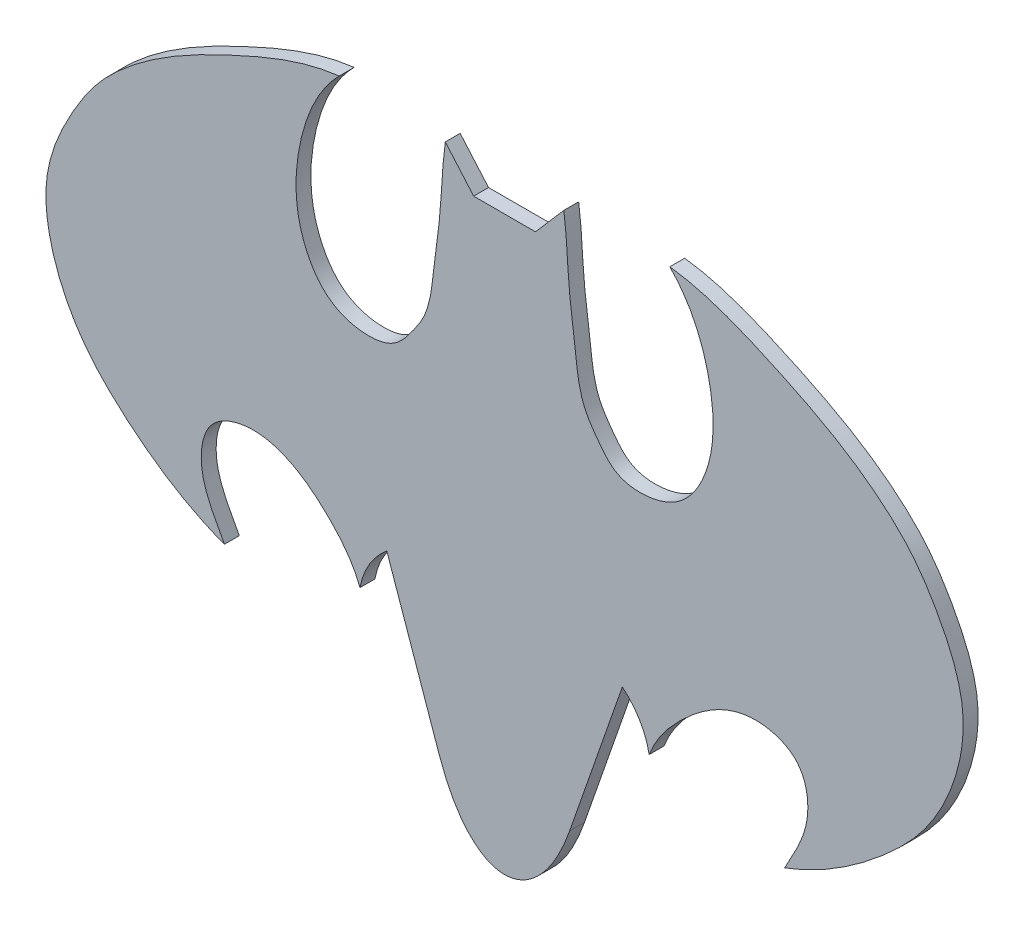
ISO-10303-21;
HEADER;
FILE_DESCRIPTION(('STEP AP214'),'2;1');
FILE_NAME('part.step','',(''),(''),'','','');
FILE_SCHEMA(('AUTOMOTIVE_DESIGN { 1 0 10303 214 1 1 1 1 }'));
ENDSEC;
DATA;
#1=APPLICATION_CONTEXT('core data for automotive mechanical design processes');
#2=APPLICATION_PROTOCOL_DEFINITION('international standard','automotive_design',2000,#1);
#3=PRODUCT_CONTEXT('',#1,'mechanical');
#4=PRODUCT('Part','Part','',(#3));
#5=PRODUCT_RELATED_PRODUCT_CATEGORY('part','',(#4));
#6=PRODUCT_DEFINITION_FORMATION('','',#4);
#7=PRODUCT_DEFINITION_CONTEXT('part definition',#1,'design');
#8=PRODUCT_DEFINITION('design','',#6,#7);
#9=PRODUCT_DEFINITION_SHAPE('','',#8);
#10=(LENGTH_UNIT() NAMED_UNIT(*) SI_UNIT(.MILLI.,.METRE.));
#11=(NAMED_UNIT(*) PLANE_ANGLE_UNIT() SI_UNIT($,.RADIAN.));
#12=(NAMED_UNIT(*) SI_UNIT($,.STERADIAN.) SOLID_ANGLE_UNIT());
#13=UNCERTAINTY_MEASURE_WITH_UNIT(LENGTH_MEASURE(1.E-05),#10,'distance_accuracy_value','');
#14=(GEOMETRIC_REPRESENTATION_CONTEXT(3) GLOBAL_UNCERTAINTY_ASSIGNED_CONTEXT((#13)) GLOBAL_UNIT_ASSIGNED_CONTEXT((#10,
#11,#12)) REPRESENTATION_CONTEXT('',''));
#15=CARTESIAN_POINT('',(0.,0.,0.));
#16=DIRECTION('',(0.,0.,1.));
#17=DIRECTION('',(1.,0.,0.));
#18=AXIS2_PLACEMENT_3D('',#15,#16,#17);
#19=CARTESIAN_POINT('',(2.91097769335724,-1.01599086634286,1.2));
#20=DIRECTION('',(-0.944146352840561,0.329526424460721,0.));
#21=DIRECTION('',(-0.329526424460721,-0.944146352840561,0.));
#22=AXIS2_PLACEMENT_3D('',#19,#20,#21);
#23=PLANE('',#22);
#24=DIRECTION('',(0.329526424460721,0.944146352840561,0.));
#25=VECTOR('',#24,1.);
#26=CARTESIAN_POINT('',(2.91097769335724,-1.01599086634286,0.));
#27=LINE('',#26,#25);
#28=CARTESIAN_POINT('',(5.24215606385606,5.66321114281078,0.));
#29=VERTEX_POINT('',#28);
#30=CARTESIAN_POINT('',(9.49550907758728,17.8497535174615,0.));
#31=VERTEX_POINT('',#30);
#32=EDGE_CURVE('E171',#29,#31,#27,.T.);
#33=ORIENTED_EDGE('',*,*,#32,.T.);
#34=DIRECTION('',(0.,0.,-1.));
#35=VECTOR('',#34,1.);
#36=CARTESIAN_POINT('',(9.49550907758728,17.8497535174615,1.2));
#37=LINE('',#36,#35);
#38=CARTESIAN_POINT('',(9.49550907758728,17.8497535174615,1.2));
#39=VERTEX_POINT('',#38);
#40=EDGE_CURVE('E11',#39,#31,#37,.T.);
#41=ORIENTED_EDGE('',*,*,#40,.F.);
#42=DIRECTION('',(0.329526424460721,0.944146352840561,0.));
#43=VECTOR('',#42,1.);
#44=CARTESIAN_POINT('',(2.91097769335724,-1.01599086634286,1.2));
#45=LINE('',#44,#43);
#46=CARTESIAN_POINT('',(5.24215606385606,5.66321114281078,1.2));
#47=VERTEX_POINT('',#46);
#48=EDGE_CURVE('E107',#47,#39,#45,.T.);
#49=ORIENTED_EDGE('',*,*,#48,.F.);
#50=DIRECTION('',(0.,0.,-1.));
#51=VECTOR('',#50,1.);
#52=CARTESIAN_POINT('',(5.24215606385606,5.66321114281078,1.2));
#53=LINE('',#52,#51);
#54=EDGE_CURVE('E163',#47,#29,#53,.T.);
#55=ORIENTED_EDGE('',*,*,#54,.T.);
#56=EDGE_LOOP('',(#33,#41,#49,#55));
#57=FACE_BOUND('',#56,.T.);
#58=ADVANCED_FACE('F37',(#57),#23,.F.);
#59=CARTESIAN_POINT('',(11.6563700098422,14.2071593745175,1.2));
#60=CARTESIAN_POINT('',(11.397676730035,15.6322639770814,1.2));
#61=CARTESIAN_POINT('',(10.2418423448879,17.5492970826512,1.2));
#62=CARTESIAN_POINT('',(7.6135805092028,19.1210919913713,1.2));
#63=CARTESIAN_POINT('',(5.45725521791302,18.2762294624857,1.2));
#64=CARTESIAN_POINT('',(3.43689695889508,16.7787112485097,1.2));
#65=CARTESIAN_POINT('',(1.33628195513624,13.9455259874936,1.2));
#66=CARTESIAN_POINT('',(0.549829783100489,11.4106469677118,1.2));
#67=CARTESIAN_POINT('',(0.,10.0000000000002,1.2));
#68=B_SPLINE_CURVE_WITH_KNOTS('',3,(#59,#60,#61,#62,#63,#64,#65,#66,#67),.UNSPECIFIED.,.F.,.F.,
(4,1,1,1,1,1,4),(0.,0.2296006125043,0.350520407054205,0.447204325314814,0.5770238243554,
0.756537919799354,1.),.UNSPECIFIED.);
#69=DIRECTION('',(0.,0.,-1.));
#70=VECTOR('',#69,1.);
#71=SURFACE_OF_LINEAR_EXTRUSION('',#68,#70);
#72=CARTESIAN_POINT('',(11.6563700098422,14.2071593745175,0.));
#73=CARTESIAN_POINT('',(11.397676730035,15.6322639770814,0.));
#74=CARTESIAN_POINT('',(10.2418423448879,17.5492970826512,0.));
#75=CARTESIAN_POINT('',(7.6135805092028,19.1210919913713,0.));
#76=CARTESIAN_POINT('',(5.45725521791302,18.2762294624857,0.));
#77=CARTESIAN_POINT('',(3.43689695889508,16.7787112485097,0.));
#78=CARTESIAN_POINT('',(1.33628195513624,13.9455259874936,0.));
#79=CARTESIAN_POINT('',(0.549829783100489,11.4106469677118,0.));
#80=CARTESIAN_POINT('',(0.,10.0000000000002,0.));
#81=B_SPLINE_CURVE_WITH_KNOTS('',3,(#72,#73,#74,#75,#76,#77,#78,#79,#80),.UNSPECIFIED.,.F.,.F.,
(4,1,1,1,1,1,4),(0.,0.2296006125043,0.350520407054205,0.447204325314814,0.5770238243554,
0.756537919799354,1.),.UNSPECIFIED.);
#82=CARTESIAN_POINT('',(11.6563700098422,14.2071593745175,0.));
#83=VERTEX_POINT('',#82);
#84=EDGE_CURVE('E308',#83,#31,#81,.T.);
#85=ORIENTED_EDGE('',*,*,#84,.F.);
#86=DIRECTION('',(0.,0.,-1.));
#87=VECTOR('',#86,1.);
#88=CARTESIAN_POINT('',(11.6563700098422,14.2071593745175,1.2));
#89=LINE('',#88,#87);
#90=CARTESIAN_POINT('',(11.6563700098422,14.2071593745175,1.2));
#91=VERTEX_POINT('',#90);
#92=EDGE_CURVE('E45',#91,#83,#89,.T.);
#93=ORIENTED_EDGE('',*,*,#92,.F.);
#94=EDGE_CURVE('E380',#91,#39,#68,.T.);
#95=ORIENTED_EDGE('',*,*,#94,.T.);
#96=ORIENTED_EDGE('',*,*,#40,.T.);
#97=EDGE_LOOP('',(#85,#93,#95,#96));
#98=FACE_BOUND('',#97,.T.);
#99=ADVANCED_FACE('F309',(#98),#71,.T.);
#100=CARTESIAN_POINT('',(22.5841524386746,11.7684734652583,1.2));
#101=CARTESIAN_POINT('',(23.3363204891086,13.1723458745344,1.2));
#102=CARTESIAN_POINT('',(24.8223688309777,15.5412172503235,1.2));
#103=CARTESIAN_POINT('',(24.152224300758,20.1442162870874,1.2));
#104=CARTESIAN_POINT('',(20.0918427920317,21.3197335137072,1.2));
#105=CARTESIAN_POINT('',(16.8154257802603,20.1167681021577,1.2));
#106=CARTESIAN_POINT('',(13.8873672886592,17.7527385178038,1.2));
#107=CARTESIAN_POINT('',(12.2178512937736,15.7059440536443,1.2));
#108=CARTESIAN_POINT('',(11.6563700098422,14.2071593745175,1.2));
#109=B_SPLINE_CURVE_WITH_KNOTS('',3,(#100,#101,#102,#103,#104,#105,#106,#107,#108),
.UNSPECIFIED.,.F.,.F.,(4,1,1,1,1,1,4),(0.,0.205854259329102,0.355134320336196,0.518085323207197,
0.666937553174599,0.795303167325571,1.),.UNSPECIFIED.);
#110=DIRECTION('',(0.,0.,-1.));
#111=VECTOR('',#110,1.);
#112=SURFACE_OF_LINEAR_EXTRUSION('',#109,#111);
#113=CARTESIAN_POINT('',(22.5841524386746,11.7684734652583,0.));
#114=CARTESIAN_POINT('',(23.3363204891086,13.1723458745344,0.));
#115=CARTESIAN_POINT('',(24.8223688309777,15.5412172503235,0.));
#116=CARTESIAN_POINT('',(24.152224300758,20.1442162870874,0.));
#117=CARTESIAN_POINT('',(20.0918427920317,21.3197335137072,0.));
#118=CARTESIAN_POINT('',(16.8154257802603,20.1167681021577,0.));
#119=CARTESIAN_POINT('',(13.8873672886592,17.7527385178038,0.));
#120=CARTESIAN_POINT('',(12.2178512937736,15.7059440536443,0.));
#121=CARTESIAN_POINT('',(11.6563700098422,14.2071593745175,0.));
#122=B_SPLINE_CURVE_WITH_KNOTS('',3,(#113,#114,#115,#116,#117,#118,#119,#120,#121),
.UNSPECIFIED.,.F.,.F.,(4,1,1,1,1,1,4),(0.,0.205854259329102,0.355134320336196,0.518085323207197,
0.666937553174599,0.795303167325571,1.),.UNSPECIFIED.);
#123=CARTESIAN_POINT('',(22.5841524386746,11.7684734652583,0.));
#124=VERTEX_POINT('',#123);
#125=EDGE_CURVE('E301',#124,#83,#122,.T.);
#126=ORIENTED_EDGE('',*,*,#125,.F.);
#127=DIRECTION('',(0.,0.,-1.));
#128=VECTOR('',#127,1.);
#129=CARTESIAN_POINT('',(22.5841524386746,11.7684734652583,1.2));
#130=LINE('',#129,#128);
#131=CARTESIAN_POINT('',(22.5841524386746,11.7684734652583,1.2));
#132=VERTEX_POINT('',#131);
#133=EDGE_CURVE('E294',#132,#124,#130,.T.);
#134=ORIENTED_EDGE('',*,*,#133,.F.);
#135=EDGE_CURVE('E304',#132,#91,#109,.T.);
#136=ORIENTED_EDGE('',*,*,#135,.T.);
#137=ORIENTED_EDGE('',*,*,#92,.T.);
#138=EDGE_LOOP('',(#126,#134,#136,#137));
#139=FACE_BOUND('',#138,.T.);
#140=ADVANCED_FACE('F299',(#139),#112,.T.);
#141=CARTESIAN_POINT('',(13.3216493928343,49.0966009830844,1.2));
#142=CARTESIAN_POINT('',(15.4924640287297,48.8365696630427,1.2));
#143=CARTESIAN_POINT('',(18.4698741281813,47.8177588608282,1.2));
#144=CARTESIAN_POINT('',(22.3145465703154,46.0821036797363,1.2));
#145=CARTESIAN_POINT('',(26.0368496464502,44.2686057979136,1.2));
#146=CARTESIAN_POINT('',(29.7302468118731,41.9345347446466,1.2));
#147=CARTESIAN_POINT('',(32.9847805520693,38.8231998492142,1.2));
#148=CARTESIAN_POINT('',(35.372450417055,35.1051659014336,1.2));
#149=CARTESIAN_POINT('',(37.2566291173604,30.7817907532244,1.2));
#150=CARTESIAN_POINT('',(36.8240330322669,26.309450685527,1.2));
#151=CARTESIAN_POINT('',(35.6172776180551,22.7641563490727,1.2));
#152=CARTESIAN_POINT('',(33.6605380217441,19.5702819058924,1.2));
#153=CARTESIAN_POINT('',(29.4402091246139,15.4306585171175,1.2));
#154=CARTESIAN_POINT('',(25.6634078981303,12.9155387615074,1.2));
#155=CARTESIAN_POINT('',(22.5841524386746,11.7684734652583,1.2));
#156=B_SPLINE_CURVE_WITH_KNOTS('',3,(#141,#142,#143,#144,#145,#146,#147,#148,#149,#150,#151,
#152,#153,#154,#155),.UNSPECIFIED.,.F.,.F.,(4,1,1,1,1,1,1,1,1,1,1,1,4),(0.,0.114464816633258,
0.165055863543866,0.222504687994984,0.332841562793707,0.394026530237335,0.45800770000997,
0.565829823981422,0.633836882505996,0.689565343984703,0.762737099766238,0.828769581828576,1.),.UNSPECIFIED.);
#157=DIRECTION('',(0.,0.,-1.));
#158=VECTOR('',#157,1.);
#159=SURFACE_OF_LINEAR_EXTRUSION('',#156,#158);
#160=CARTESIAN_POINT('',(13.3216493928343,49.0966009830844,0.));
#161=CARTESIAN_POINT('',(15.4924640287297,48.8365696630427,0.));
#162=CARTESIAN_POINT('',(18.4698741281813,47.8177588608282,0.));
#163=CARTESIAN_POINT('',(22.3145465703154,46.0821036797363,0.));
#164=CARTESIAN_POINT('',(26.0368496464502,44.2686057979136,0.));
#165=CARTESIAN_POINT('',(29.7302468118731,41.9345347446466,0.));
#166=CARTESIAN_POINT('',(32.9847805520693,38.8231998492142,0.));
#167=CARTESIAN_POINT('',(35.372450417055,35.1051659014336,0.));
#168=CARTESIAN_POINT('',(37.2566291173604,30.7817907532244,0.));
#169=CARTESIAN_POINT('',(36.8240330322669,26.309450685527,0.));
#170=CARTESIAN_POINT('',(35.6172776180551,22.7641563490727,0.));
#171=CARTESIAN_POINT('',(33.6605380217441,19.5702819058924,0.));
#172=CARTESIAN_POINT('',(29.4402091246139,15.4306585171175,0.));
#173=CARTESIAN_POINT('',(25.6634078981303,12.9155387615074,0.));
#174=CARTESIAN_POINT('',(22.5841524386746,11.7684734652583,0.));
#175=B_SPLINE_CURVE_WITH_KNOTS('',3,(#160,#161,#162,#163,#164,#165,#166,#167,#168,#169,#170,
#171,#172,#173,#174),.UNSPECIFIED.,.F.,.F.,(4,1,1,1,1,1,1,1,1,1,1,1,4),(0.,0.114464816633258,
0.165055863543866,0.222504687994984,0.332841562793707,0.394026530237335,0.45800770000997,
0.565829823981422,0.633836882505996,0.689565343984703,0.762737099766238,0.828769581828576,1.),.UNSPECIFIED.);
#176=CARTESIAN_POINT('',(13.3216493928343,49.0966009830844,0.));
#177=VERTEX_POINT('',#176);
#178=EDGE_CURVE('E315',#177,#124,#175,.T.);
#179=ORIENTED_EDGE('',*,*,#178,.F.);
#180=DIRECTION('',(0.,0.,-1.));
#181=VECTOR('',#180,1.);
#182=CARTESIAN_POINT('',(13.3216493928343,49.0966009830844,1.2));
#183=LINE('',#182,#181);
#184=CARTESIAN_POINT('',(13.3216493928343,49.0966009830844,1.2));
#185=VERTEX_POINT('',#184);
#186=EDGE_CURVE('E292',#185,#177,#183,.T.);
#187=ORIENTED_EDGE('',*,*,#186,.F.);
#188=EDGE_CURVE('E246',#185,#132,#156,.T.);
#189=ORIENTED_EDGE('',*,*,#188,.T.);
#190=ORIENTED_EDGE('',*,*,#133,.T.);
#191=EDGE_LOOP('',(#179,#187,#189,#190));
#192=FACE_BOUND('',#191,.T.);
#193=ADVANCED_FACE('F235',(#192),#159,.T.);
#194=CARTESIAN_POINT('',(4.77721824076915,48.7658811138146,1.2));
#195=CARTESIAN_POINT('',(5.03050292995623,47.0281789536312,1.2));
#196=CARTESIAN_POINT('',(5.07303657499563,43.8534602594582,1.2));
#197=CARTESIAN_POINT('',(5.73146001713426,39.5651755041231,1.2));
#198=CARTESIAN_POINT('',(6.03370024447577,36.2260769045719,1.2));
#199=CARTESIAN_POINT('',(7.51298516193875,34.0787207748022,1.2));
#200=CARTESIAN_POINT('',(8.83753959519586,32.3656009643095,1.2));
#201=CARTESIAN_POINT('',(11.4705553930665,31.9512170833034,1.2));
#202=CARTESIAN_POINT('',(14.2334724200595,32.7938033800342,1.2));
#203=CARTESIAN_POINT('',(16.1609704196722,35.5183898233696,1.2));
#204=CARTESIAN_POINT('',(16.9877876127939,38.9067980806341,1.2));
#205=CARTESIAN_POINT('',(16.5543103145127,43.8287993359296,1.2));
#206=CARTESIAN_POINT('',(15.0510316387489,47.3674564948699,1.2));
#207=CARTESIAN_POINT('',(13.3216493928343,49.0966009830844,1.2));
#208=B_SPLINE_CURVE_WITH_KNOTS('',3,(#194,#195,#196,#197,#198,#199,#200,#201,#202,#203,#204,
#205,#206,#207),.UNSPECIFIED.,.F.,.F.,(4,1,1,1,1,1,1,1,1,1,1,4),(0.,0.131609133993092,
0.235936851986378,0.328168246784935,0.373910171744129,0.430745972127253,0.482425313130639,
0.562606571701551,0.634043740261748,0.721471282750536,0.819469906842683,1.),.UNSPECIFIED.);
#209=DIRECTION('',(0.,0.,-1.));
#210=VECTOR('',#209,1.);
#211=SURFACE_OF_LINEAR_EXTRUSION('',#208,#210);
#212=CARTESIAN_POINT('',(4.77721824076915,48.7658811138146,0.));
#213=CARTESIAN_POINT('',(5.03050292995623,47.0281789536312,0.));
#214=CARTESIAN_POINT('',(5.07303657499563,43.8534602594582,0.));
#215=CARTESIAN_POINT('',(5.73146001713426,39.5651755041231,0.));
#216=CARTESIAN_POINT('',(6.03370024447577,36.2260769045719,0.));
#217=CARTESIAN_POINT('',(7.51298516193875,34.0787207748022,0.));
#218=CARTESIAN_POINT('',(8.83753959519586,32.3656009643095,0.));
#219=CARTESIAN_POINT('',(11.4705553930665,31.9512170833034,0.));
#220=CARTESIAN_POINT('',(14.2334724200595,32.7938033800342,0.));
#221=CARTESIAN_POINT('',(16.1609704196722,35.5183898233696,0.));
#222=CARTESIAN_POINT('',(16.9877876127939,38.9067980806341,0.));
#223=CARTESIAN_POINT('',(16.5543103145127,43.8287993359296,0.));
#224=CARTESIAN_POINT('',(15.0510316387489,47.3674564948699,0.));
#225=CARTESIAN_POINT('',(13.3216493928343,49.0966009830844,0.));
#226=B_SPLINE_CURVE_WITH_KNOTS('',3,(#212,#213,#214,#215,#216,#217,#218,#219,#220,#221,#222,
#223,#224,#225),.UNSPECIFIED.,.F.,.F.,(4,1,1,1,1,1,1,1,1,1,1,4),(0.,0.131609133993092,
0.235936851986378,0.328168246784935,0.373910171744129,0.430745972127253,0.482425313130639,
0.562606571701551,0.634043740261748,0.721471282750536,0.819469906842683,1.),.UNSPECIFIED.);
#227=CARTESIAN_POINT('',(4.77721824076915,48.7658811138146,0.));
#228=VERTEX_POINT('',#227);
#229=EDGE_CURVE('E317',#228,#177,#226,.T.);
#230=ORIENTED_EDGE('',*,*,#229,.F.);
#231=DIRECTION('',(0.,0.,-1.));
#232=VECTOR('',#231,1.);
#233=CARTESIAN_POINT('',(4.77721824076915,48.7658811138146,1.2));
#234=LINE('',#233,#232);
#235=CARTESIAN_POINT('',(4.77721824076915,48.7658811138146,1.2));
#236=VERTEX_POINT('',#235);
#237=EDGE_CURVE('E290',#236,#228,#234,.T.);
#238=ORIENTED_EDGE('',*,*,#237,.F.);
#239=EDGE_CURVE('E239',#236,#185,#208,.T.);
#240=ORIENTED_EDGE('',*,*,#239,.T.);
#241=ORIENTED_EDGE('',*,*,#186,.T.);
#242=EDGE_LOOP('',(#230,#238,#240,#241));
#243=FACE_BOUND('',#242,.T.);
#244=ADVANCED_FACE('F230',(#243),#211,.T.);
#245=CARTESIAN_POINT('',(-21.3961918610227,18.5078672802146,1.2));
#246=DIRECTION('',(-0.756309780410387,0.654213662388361,0.));
#247=DIRECTION('',(-0.654213662388361,-0.756309780410387,0.));
#248=AXIS2_PLACEMENT_3D('',#245,#246,#247);
#249=PLANE('',#248);
#250=DIRECTION('',(0.654213662388362,0.756309780410387,0.));
#251=VECTOR('',#250,1.);
#252=CARTESIAN_POINT('',(-21.3961918610227,18.5078672802146,0.));
#253=LINE('',#252,#251);
#254=CARTESIAN_POINT('',(2.49171451387908,46.1237033037382,0.));
#255=VERTEX_POINT('',#254);
#256=EDGE_CURVE('E335',#255,#228,#253,.T.);
#257=ORIENTED_EDGE('',*,*,#256,.F.);
#258=DIRECTION('',(0.,0.,-1.));
#259=VECTOR('',#258,1.);
#260=CARTESIAN_POINT('',(2.49171451387908,46.1237033037382,1.2));
#261=LINE('',#260,#259);
#262=CARTESIAN_POINT('',(2.49171451387908,46.1237033037382,1.2));
#263=VERTEX_POINT('',#262);
#264=EDGE_CURVE('E288',#263,#255,#261,.T.);
#265=ORIENTED_EDGE('',*,*,#264,.F.);
#266=DIRECTION('',(0.654213662388362,0.756309780410387,0.));
#267=VECTOR('',#266,1.);
#268=CARTESIAN_POINT('',(-21.3961918610227,18.5078672802146,1.2));
#269=LINE('',#268,#267);
#270=EDGE_CURVE('E245',#263,#236,#269,.T.);
#271=ORIENTED_EDGE('',*,*,#270,.T.);
#272=ORIENTED_EDGE('',*,*,#237,.T.);
#273=EDGE_LOOP('',(#257,#265,#271,#272));
#274=FACE_BOUND('',#273,.T.);
#275=ADVANCED_FACE('F226',(#274),#249,.T.);
#276=CARTESIAN_POINT('',(0.,46.1237033037382,1.2));
#277=DIRECTION('',(0.,1.,0.));
#278=DIRECTION('',(0.,0.,1.));
#279=AXIS2_PLACEMENT_3D('',#276,#277,#278);
#280=PLANE('',#279);
#281=DIRECTION('',(1.,0.,0.));
#282=VECTOR('',#281,1.);
#283=CARTESIAN_POINT('',(0.,46.1237033037382,0.));
#284=LINE('',#283,#282);
#285=CARTESIAN_POINT('',(-2.49171451387912,46.1237033037382,0.));
#286=VERTEX_POINT('',#285);
#287=EDGE_CURVE('E341',#286,#255,#284,.T.);
#288=ORIENTED_EDGE('',*,*,#287,.F.);
#289=DIRECTION('',(0.,0.,-1.));
#290=VECTOR('',#289,1.);
#291=CARTESIAN_POINT('',(-2.49171451387912,46.1237033037382,1.2));
#292=LINE('',#291,#290);
#293=CARTESIAN_POINT('',(-2.49171451387912,46.1237033037382,1.2));
#294=VERTEX_POINT('',#293);
#295=EDGE_CURVE('E268',#294,#286,#292,.T.);
#296=ORIENTED_EDGE('',*,*,#295,.F.);
#297=DIRECTION('',(1.,0.,0.));
#298=VECTOR('',#297,1.);
#299=CARTESIAN_POINT('',(0.,46.1237033037382,1.2));
#300=LINE('',#299,#298);
#301=EDGE_CURVE('E255',#294,#263,#300,.T.);
#302=ORIENTED_EDGE('',*,*,#301,.T.);
#303=ORIENTED_EDGE('',*,*,#264,.T.);
#304=EDGE_LOOP('',(#288,#296,#302,#303));
#305=FACE_BOUND('',#304,.T.);
#306=ADVANCED_FACE('F222',(#305),#280,.T.);
#307=CARTESIAN_POINT('',(21.3961918610227,18.5078672802146,1.2));
#308=DIRECTION('',(-0.756309780410387,-0.654213662388361,0.));
#309=DIRECTION('',(0.654213662388361,-0.756309780410387,0.));
#310=AXIS2_PLACEMENT_3D('',#307,#308,#309);
#311=PLANE('',#310);
#312=DIRECTION('',(-0.654213662388362,0.756309780410387,0.));
#313=VECTOR('',#312,1.);
#314=CARTESIAN_POINT('',(21.3961918610227,18.5078672802146,0.));
#315=LINE('',#314,#313);
#316=CARTESIAN_POINT('',(-4.77721824076919,48.7658811138146,0.));
#317=VERTEX_POINT('',#316);
#318=EDGE_CURVE('E266',#286,#317,#315,.T.);
#319=ORIENTED_EDGE('',*,*,#318,.T.);
#320=DIRECTION('',(0.,0.,-1.));
#321=VECTOR('',#320,1.);
#322=CARTESIAN_POINT('',(-4.77721824076919,48.7658811138146,1.2));
#323=LINE('',#322,#321);
#324=CARTESIAN_POINT('',(-4.77721824076919,48.7658811138146,1.2));
#325=VERTEX_POINT('',#324);
#326=EDGE_CURVE('E264',#325,#317,#323,.T.);
#327=ORIENTED_EDGE('',*,*,#326,.F.);
#328=DIRECTION('',(-0.654213662388362,0.756309780410387,0.));
#329=VECTOR('',#328,1.);
#330=CARTESIAN_POINT('',(21.3961918610227,18.5078672802146,1.2));
#331=LINE('',#330,#329);
#332=EDGE_CURVE('E210',#294,#325,#331,.T.);
#333=ORIENTED_EDGE('',*,*,#332,.F.);
#334=ORIENTED_EDGE('',*,*,#295,.T.);
#335=EDGE_LOOP('',(#319,#327,#333,#334));
#336=FACE_BOUND('',#335,.T.);
#337=ADVANCED_FACE('F218',(#336),#311,.F.);
#338=CARTESIAN_POINT('',(-4.7772182407692,48.7658811138146,1.2));
#339=CARTESIAN_POINT('',(-5.03050292995629,47.0281789536312,1.2));
#340=CARTESIAN_POINT('',(-5.07303657499568,43.8534602594582,1.2));
#341=CARTESIAN_POINT('',(-5.7314600171343,39.5651755041231,1.2));
#342=CARTESIAN_POINT('',(-6.03370024447582,36.2260769045719,1.2));
#343=CARTESIAN_POINT('',(-7.5129851619388,34.0787207748022,1.2));
#344=CARTESIAN_POINT('',(-8.83753959519589,32.3656009643095,1.2));
#345=CARTESIAN_POINT('',(-11.4705553930665,31.9512170833034,1.2));
#346=CARTESIAN_POINT('',(-14.2334724200596,32.7938033800342,1.2));
#347=CARTESIAN_POINT('',(-16.1609704196723,35.5183898233696,1.2));
#348=CARTESIAN_POINT('',(-16.9877876127939,38.9067980806341,1.2));
#349=CARTESIAN_POINT('',(-16.5543103145128,43.8287993359296,1.2));
#350=CARTESIAN_POINT('',(-15.0510316387489,47.3674564948699,1.2));
#351=CARTESIAN_POINT('',(-13.3216493928344,49.0966009830844,1.2));
#352=B_SPLINE_CURVE_WITH_KNOTS('',3,(#338,#339,#340,#341,#342,#343,#344,#345,#346,#347,#348,
#349,#350,#351),.UNSPECIFIED.,.F.,.F.,(4,1,1,1,1,1,1,1,1,1,1,4),(0.,0.131609133993092,
0.235936851986378,0.328168246784935,0.373910171744128,0.430745972127253,0.482425313130639,
0.562606571701551,0.634043740261748,0.721471282750536,0.819469906842683,1.),.UNSPECIFIED.);
#353=DIRECTION('',(0.,0.,-1.));
#354=VECTOR('',#353,1.);
#355=SURFACE_OF_LINEAR_EXTRUSION('',#352,#354);
#356=CARTESIAN_POINT('',(-4.7772182407692,48.7658811138146,0.));
#357=CARTESIAN_POINT('',(-5.03050292995629,47.0281789536312,0.));
#358=CARTESIAN_POINT('',(-5.07303657499568,43.8534602594582,0.));
#359=CARTESIAN_POINT('',(-5.7314600171343,39.5651755041231,0.));
#360=CARTESIAN_POINT('',(-6.03370024447582,36.2260769045719,0.));
#361=CARTESIAN_POINT('',(-7.5129851619388,34.0787207748022,0.));
#362=CARTESIAN_POINT('',(-8.83753959519589,32.3656009643095,0.));
#363=CARTESIAN_POINT('',(-11.4705553930665,31.9512170833034,0.));
#364=CARTESIAN_POINT('',(-14.2334724200596,32.7938033800342,0.));
#365=CARTESIAN_POINT('',(-16.1609704196723,35.5183898233696,0.));
#366=CARTESIAN_POINT('',(-16.9877876127939,38.9067980806341,0.));
#367=CARTESIAN_POINT('',(-16.5543103145128,43.8287993359296,0.));
#368=CARTESIAN_POINT('',(-15.0510316387489,47.3674564948699,0.));
#369=CARTESIAN_POINT('',(-13.3216493928344,49.0966009830844,0.));
#370=B_SPLINE_CURVE_WITH_KNOTS('',3,(#356,#357,#358,#359,#360,#361,#362,#363,#364,#365,#366,
#367,#368,#369),.UNSPECIFIED.,.F.,.F.,(4,1,1,1,1,1,1,1,1,1,1,4),(0.,0.131609133993092,
0.235936851986378,0.328168246784935,0.373910171744128,0.430745972127253,0.482425313130639,
0.562606571701551,0.634043740261748,0.721471282750536,0.819469906842683,1.),.UNSPECIFIED.);
#371=CARTESIAN_POINT('',(-13.3216493928344,49.0966009830844,0.));
#372=VERTEX_POINT('',#371);
#373=EDGE_CURVE('E273',#317,#372,#370,.T.);
#374=ORIENTED_EDGE('',*,*,#373,.T.);
#375=DIRECTION('',(0.,0.,-1.));
#376=VECTOR('',#375,1.);
#377=CARTESIAN_POINT('',(-13.3216493928344,49.0966009830844,1.2));
#378=LINE('',#377,#376);
#379=CARTESIAN_POINT('',(-13.3216493928344,49.0966009830844,1.2));
#380=VERTEX_POINT('',#379);
#381=EDGE_CURVE('E269',#380,#372,#378,.T.);
#382=ORIENTED_EDGE('',*,*,#381,.F.);
#383=EDGE_CURVE('E202',#325,#380,#352,.T.);
#384=ORIENTED_EDGE('',*,*,#383,.F.);
#385=ORIENTED_EDGE('',*,*,#326,.T.);
#386=EDGE_LOOP('',(#374,#382,#384,#385));
#387=FACE_BOUND('',#386,.T.);
#388=ADVANCED_FACE('F215',(#387),#355,.F.);
#389=CARTESIAN_POINT('',(-13.3216493928344,49.0966009830844,1.2));
#390=CARTESIAN_POINT('',(-15.4924640287298,48.8365696630427,1.2));
#391=CARTESIAN_POINT('',(-18.4698741281814,47.8177588608282,1.2));
#392=CARTESIAN_POINT('',(-22.3145465703154,46.0821036797362,1.2));
#393=CARTESIAN_POINT('',(-26.0368496464502,44.2686057979136,1.2));
#394=CARTESIAN_POINT('',(-29.7302468118732,41.9345347446465,1.2));
#395=CARTESIAN_POINT('',(-32.9847805520694,38.8231998492141,1.2));
#396=CARTESIAN_POINT('',(-35.372450417055,35.1051659014335,1.2));
#397=CARTESIAN_POINT('',(-37.2566291173604,30.7817907532244,1.2));
#398=CARTESIAN_POINT('',(-36.8240330322669,26.309450685527,1.2));
#399=CARTESIAN_POINT('',(-35.6172776180551,22.7641563490727,1.2));
#400=CARTESIAN_POINT('',(-33.6605380217441,19.5702819058924,1.2));
#401=CARTESIAN_POINT('',(-29.4402091246139,15.4306585171175,1.2));
#402=CARTESIAN_POINT('',(-25.6634078981304,12.9155387615073,1.2));
#403=CARTESIAN_POINT('',(-22.5841524386747,11.7684734652583,1.2));
#404=B_SPLINE_CURVE_WITH_KNOTS('',3,(#389,#390,#391,#392,#393,#394,#395,#396,#397,#398,#399,
#400,#401,#402,#403),.UNSPECIFIED.,.F.,.F.,(4,1,1,1,1,1,1,1,1,1,1,1,4),(0.,0.114464816633258,
0.165055863543866,0.222504687994984,0.332841562793707,0.394026530237335,0.45800770000997,
0.565829823981422,0.633836882505996,0.689565343984703,0.762737099766238,0.828769581828576,1.),.UNSPECIFIED.);
#405=DIRECTION('',(0.,0.,-1.));
#406=VECTOR('',#405,1.);
#407=SURFACE_OF_LINEAR_EXTRUSION('',#404,#406);
#408=CARTESIAN_POINT('',(-13.3216493928344,49.0966009830844,0.));
#409=CARTESIAN_POINT('',(-15.4924640287298,48.8365696630427,0.));
#410=CARTESIAN_POINT('',(-18.4698741281814,47.8177588608282,0.));
#411=CARTESIAN_POINT('',(-22.3145465703154,46.0821036797362,0.));
#412=CARTESIAN_POINT('',(-26.0368496464502,44.2686057979136,0.));
#413=CARTESIAN_POINT('',(-29.7302468118732,41.9345347446465,0.));
#414=CARTESIAN_POINT('',(-32.9847805520694,38.8231998492141,0.));
#415=CARTESIAN_POINT('',(-35.372450417055,35.1051659014335,0.));
#416=CARTESIAN_POINT('',(-37.2566291173604,30.7817907532244,0.));
#417=CARTESIAN_POINT('',(-36.8240330322669,26.309450685527,0.));
#418=CARTESIAN_POINT('',(-35.6172776180551,22.7641563490727,0.));
#419=CARTESIAN_POINT('',(-33.6605380217441,19.5702819058924,0.));
#420=CARTESIAN_POINT('',(-29.4402091246139,15.4306585171175,0.));
#421=CARTESIAN_POINT('',(-25.6634078981304,12.9155387615073,0.));
#422=CARTESIAN_POINT('',(-22.5841524386747,11.7684734652583,0.));
#423=B_SPLINE_CURVE_WITH_KNOTS('',3,(#408,#409,#410,#411,#412,#413,#414,#415,#416,#417,#418,
#419,#420,#421,#422),.UNSPECIFIED.,.F.,.F.,(4,1,1,1,1,1,1,1,1,1,1,1,4),(0.,0.114464816633258,
0.165055863543866,0.222504687994984,0.332841562793707,0.394026530237335,0.45800770000997,
0.565829823981422,0.633836882505996,0.689565343984703,0.762737099766238,0.828769581828576,1.),.UNSPECIFIED.);
#424=CARTESIAN_POINT('',(-22.5841524386747,11.7684734652583,0.));
#425=VERTEX_POINT('',#424);
#426=EDGE_CURVE('E280',#372,#425,#423,.T.);
#427=ORIENTED_EDGE('',*,*,#426,.T.);
#428=DIRECTION('',(0.,0.,-1.));
#429=VECTOR('',#428,1.);
#430=CARTESIAN_POINT('',(-22.5841524386747,11.7684734652583,1.2));
#431=LINE('',#430,#429);
#432=CARTESIAN_POINT('',(-22.5841524386747,11.7684734652583,1.2));
#433=VERTEX_POINT('',#432);
#434=EDGE_CURVE('E276',#433,#425,#431,.T.);
#435=ORIENTED_EDGE('',*,*,#434,.F.);
#436=EDGE_CURVE('E194',#380,#433,#404,.T.);
#437=ORIENTED_EDGE('',*,*,#436,.F.);
#438=ORIENTED_EDGE('',*,*,#381,.T.);
#439=EDGE_LOOP('',(#427,#435,#437,#438));
#440=FACE_BOUND('',#439,.T.);
#441=ADVANCED_FACE('F187',(#440),#407,.F.);
#442=CARTESIAN_POINT('',(-22.5841524386747,11.7684734652583,1.2));
#443=CARTESIAN_POINT('',(-23.3363204891086,13.1723458745344,1.2));
#444=CARTESIAN_POINT('',(-24.8223688309777,15.5412172503235,1.2));
#445=CARTESIAN_POINT('',(-24.152224300758,20.1442162870874,1.2));
#446=CARTESIAN_POINT('',(-20.0918427920318,21.3197335137072,1.2));
#447=CARTESIAN_POINT('',(-16.8154257802604,20.1167681021577,1.2));
#448=CARTESIAN_POINT('',(-13.8873672886592,17.7527385178038,1.2));
#449=CARTESIAN_POINT('',(-12.2178512937737,15.7059440536443,1.2));
#450=CARTESIAN_POINT('',(-11.6563700098422,14.2071593745175,1.2));
#451=B_SPLINE_CURVE_WITH_KNOTS('',3,(#442,#443,#444,#445,#446,#447,#448,#449,#450),
.UNSPECIFIED.,.F.,.F.,(4,1,1,1,1,1,4),(0.,0.205854259329101,0.355134320336196,0.518085323207197,
0.666937553174598,0.795303167325571,1.),.UNSPECIFIED.);
#452=DIRECTION('',(0.,0.,-1.));
#453=VECTOR('',#452,1.);
#454=SURFACE_OF_LINEAR_EXTRUSION('',#451,#453);
#455=CARTESIAN_POINT('',(-22.5841524386747,11.7684734652583,0.));
#456=CARTESIAN_POINT('',(-23.3363204891086,13.1723458745344,0.));
#457=CARTESIAN_POINT('',(-24.8223688309777,15.5412172503235,0.));
#458=CARTESIAN_POINT('',(-24.152224300758,20.1442162870874,0.));
#459=CARTESIAN_POINT('',(-20.0918427920318,21.3197335137072,0.));
#460=CARTESIAN_POINT('',(-16.8154257802604,20.1167681021577,0.));
#461=CARTESIAN_POINT('',(-13.8873672886592,17.7527385178038,0.));
#462=CARTESIAN_POINT('',(-12.2178512937737,15.7059440536443,0.));
#463=CARTESIAN_POINT('',(-11.6563700098422,14.2071593745175,0.));
#464=B_SPLINE_CURVE_WITH_KNOTS('',3,(#455,#456,#457,#458,#459,#460,#461,#462,#463),
.UNSPECIFIED.,.F.,.F.,(4,1,1,1,1,1,4),(0.,0.205854259329101,0.355134320336196,0.518085323207197,
0.666937553174598,0.795303167325571,1.),.UNSPECIFIED.);
#465=CARTESIAN_POINT('',(-11.6563700098422,14.2071593745175,0.));
#466=VERTEX_POINT('',#465);
#467=EDGE_CURVE('E283',#425,#466,#464,.T.);
#468=ORIENTED_EDGE('',*,*,#467,.T.);
#469=DIRECTION('',(0.,0.,-1.));
#470=VECTOR('',#469,1.);
#471=CARTESIAN_POINT('',(-11.6563700098422,14.2071593745175,1.2));
#472=LINE('',#471,#470);
#473=CARTESIAN_POINT('',(-11.6563700098422,14.2071593745175,1.2));
#474=VERTEX_POINT('',#473);
#475=EDGE_CURVE('E159',#474,#466,#472,.T.);
#476=ORIENTED_EDGE('',*,*,#475,.F.);
#477=EDGE_CURVE('E146',#433,#474,#451,.T.);
#478=ORIENTED_EDGE('',*,*,#477,.F.);
#479=ORIENTED_EDGE('',*,*,#434,.T.);
#480=EDGE_LOOP('',(#468,#476,#478,#479));
#481=FACE_BOUND('',#480,.T.);
#482=ADVANCED_FACE('F184',(#481),#454,.F.);
#483=CARTESIAN_POINT('',(-11.6563700098422,14.2071593745175,1.2));
#484=CARTESIAN_POINT('',(-11.3976767300351,15.6322639770814,1.2));
#485=CARTESIAN_POINT('',(-10.2418423448879,17.5492970826512,1.2));
#486=CARTESIAN_POINT('',(-7.61358050920283,19.1210919913713,1.2));
#487=CARTESIAN_POINT('',(-5.45725521791306,18.2762294624857,1.2));
#488=CARTESIAN_POINT('',(-3.43689695889512,16.7787112485097,1.2));
#489=CARTESIAN_POINT('',(-1.33628195513626,13.9455259874936,1.2));
#490=CARTESIAN_POINT('',(-0.549829783100514,11.4106469677118,1.2));
#491=CARTESIAN_POINT('',(0.,10.0000000000002,1.2));
#492=B_SPLINE_CURVE_WITH_KNOTS('',3,(#483,#484,#485,#486,#487,#488,#489,#490,#491),
.UNSPECIFIED.,.F.,.F.,(4,1,1,1,1,1,4),(0.,0.2296006125043,0.350520407054205,0.447204325314814,
0.5770238243554,0.756537919799354,1.),.UNSPECIFIED.);
#493=DIRECTION('',(0.,0.,-1.));
#494=VECTOR('',#493,1.);
#495=SURFACE_OF_LINEAR_EXTRUSION('',#492,#494);
#496=CARTESIAN_POINT('',(-11.6563700098422,14.2071593745175,0.));
#497=CARTESIAN_POINT('',(-11.3976767300351,15.6322639770814,0.));
#498=CARTESIAN_POINT('',(-10.2418423448879,17.5492970826512,0.));
#499=CARTESIAN_POINT('',(-7.61358050920283,19.1210919913713,0.));
#500=CARTESIAN_POINT('',(-5.45725521791306,18.2762294624857,0.));
#501=CARTESIAN_POINT('',(-3.43689695889512,16.7787112485097,0.));
#502=CARTESIAN_POINT('',(-1.33628195513626,13.9455259874936,0.));
#503=CARTESIAN_POINT('',(-0.549829783100514,11.4106469677118,0.));
#504=CARTESIAN_POINT('',(0.,10.0000000000002,0.));
#505=B_SPLINE_CURVE_WITH_KNOTS('',3,(#496,#497,#498,#499,#500,#501,#502,#503,#504),
.UNSPECIFIED.,.F.,.F.,(4,1,1,1,1,1,4),(0.,0.2296006125043,0.350520407054205,0.447204325314814,
0.5770238243554,0.756537919799354,1.),.UNSPECIFIED.);
#506=CARTESIAN_POINT('',(-9.49550907758729,17.8497535174615,0.));
#507=VERTEX_POINT('',#506);
#508=EDGE_CURVE('E155',#466,#507,#505,.T.);
#509=ORIENTED_EDGE('',*,*,#508,.T.);
#510=DIRECTION('',(0.,0.,-1.));
#511=VECTOR('',#510,1.);
#512=CARTESIAN_POINT('',(-9.49550907758729,17.8497535174615,1.2));
#513=LINE('',#512,#511);
#514=CARTESIAN_POINT('',(-9.49550907758729,17.8497535174615,1.2));
#515=VERTEX_POINT('',#514);
#516=EDGE_CURVE('E152',#515,#507,#513,.T.);
#517=ORIENTED_EDGE('',*,*,#516,.F.);
#518=EDGE_CURVE('E140',#474,#515,#492,.T.);
#519=ORIENTED_EDGE('',*,*,#518,.F.);
#520=ORIENTED_EDGE('',*,*,#475,.T.);
#521=EDGE_LOOP('',(#509,#517,#519,#520));
#522=FACE_BOUND('',#521,.T.);
#523=ADVANCED_FACE('F153',(#522),#495,.F.);
#524=CARTESIAN_POINT('',(-2.91097769335724,-1.01599086634286,1.2));
#525=DIRECTION('',(-0.944146352840561,-0.329526424460721,0.));
#526=DIRECTION('',(0.329526424460721,-0.944146352840561,0.));
#527=AXIS2_PLACEMENT_3D('',#524,#525,#526);
#528=PLANE('',#527);
#529=DIRECTION('',(-0.329526424460721,0.944146352840561,0.));
#530=VECTOR('',#529,1.);
#531=CARTESIAN_POINT('',(-2.91097769335724,-1.01599086634286,0.));
#532=LINE('',#531,#530);
#533=CARTESIAN_POINT('',(-5.24215606385606,5.66321114281078,0.));
#534=VERTEX_POINT('',#533);
#535=EDGE_CURVE('E366',#534,#507,#532,.T.);
#536=ORIENTED_EDGE('',*,*,#535,.F.);
#537=DIRECTION('',(0.,0.,-1.));
#538=VECTOR('',#537,1.);
#539=CARTESIAN_POINT('',(-5.24215606385606,5.66321114281078,1.2));
#540=LINE('',#539,#538);
#541=CARTESIAN_POINT('',(-5.24215606385606,5.66321114281078,1.2));
#542=VERTEX_POINT('',#541);
#543=EDGE_CURVE('E98',#542,#534,#540,.T.);
#544=ORIENTED_EDGE('',*,*,#543,.F.);
#545=DIRECTION('',(-0.329526424460721,0.944146352840561,0.));
#546=VECTOR('',#545,1.);
#547=CARTESIAN_POINT('',(-2.91097769335724,-1.01599086634286,1.2));
#548=LINE('',#547,#546);
#549=EDGE_CURVE('E144',#542,#515,#548,.T.);
#550=ORIENTED_EDGE('',*,*,#549,.T.);
#551=ORIENTED_EDGE('',*,*,#516,.T.);
#552=EDGE_LOOP('',(#536,#544,#550,#551));
#553=FACE_BOUND('',#552,.T.);
#554=ADVANCED_FACE('F161',(#553),#528,.T.);
#555=CARTESIAN_POINT('',(0.,14.3472677354722,1.2));
#556=DIRECTION('',(0.,0.,1.));
#557=DIRECTION('',(0.,1.,0.));
#558=AXIS2_PLACEMENT_3D('',#555,#556,#557);
#559=ELLIPSE('',#558,14.3472677354722,6.58549336396856);
#560=DIRECTION('',(0.,0.,-1.));
#561=VECTOR('',#560,1.);
#562=SURFACE_OF_LINEAR_EXTRUSION('',#559,#561);
#563=CARTESIAN_POINT('',(0.,14.3472677354722,0.));
#564=DIRECTION('',(0.,0.,1.));
#565=DIRECTION('',(0.,1.,0.));
#566=AXIS2_PLACEMENT_3D('',#563,#564,#565);
#567=ELLIPSE('',#566,14.3472677354722,6.58549336396856);
#568=EDGE_CURVE('E101',#534,#29,#567,.T.);
#569=ORIENTED_EDGE('',*,*,#568,.T.);
#570=ORIENTED_EDGE('',*,*,#54,.F.);
#571=EDGE_CURVE('E53',#542,#47,#559,.T.);
#572=ORIENTED_EDGE('',*,*,#571,.F.);
#573=ORIENTED_EDGE('',*,*,#543,.T.);
#574=EDGE_LOOP('',(#569,#570,#572,#573));
#575=FACE_BOUND('',#574,.T.);
#576=ADVANCED_FACE('F174',(#575),#562,.F.);
#577=CARTESIAN_POINT('',(0.,0.,1.2));
#578=DIRECTION('',(0.,0.,1.));
#579=DIRECTION('',(1.,0.,0.));
#580=AXIS2_PLACEMENT_3D('',#577,#578,#579);
#581=PLANE('',#580);
#582=ORIENTED_EDGE('',*,*,#48,.T.);
#583=ORIENTED_EDGE('',*,*,#94,.F.);
#584=ORIENTED_EDGE('',*,*,#135,.F.);
#585=ORIENTED_EDGE('',*,*,#188,.F.);
#586=ORIENTED_EDGE('',*,*,#239,.F.);
#587=ORIENTED_EDGE('',*,*,#270,.F.);
#588=ORIENTED_EDGE('',*,*,#301,.F.);
#589=ORIENTED_EDGE('',*,*,#332,.T.);
#590=ORIENTED_EDGE('',*,*,#383,.T.);
#591=ORIENTED_EDGE('',*,*,#436,.T.);
#592=ORIENTED_EDGE('',*,*,#477,.T.);
#593=ORIENTED_EDGE('',*,*,#518,.T.);
#594=ORIENTED_EDGE('',*,*,#549,.F.);
#595=ORIENTED_EDGE('',*,*,#571,.T.);
#596=EDGE_LOOP('',(#582,#583,#584,#585,#586,#587,#588,#589,#590,#591,#592,#593,#594,#595));
#597=FACE_BOUND('',#596,.T.);
#598=ADVANCED_FACE('F142',(#597),#581,.T.);
#599=CARTESIAN_POINT('',(0.,0.,0.));
#600=DIRECTION('',(0.,0.,1.));
#601=DIRECTION('',(1.,0.,0.));
#602=AXIS2_PLACEMENT_3D('',#599,#600,#601);
#603=PLANE('',#602);
#604=ORIENTED_EDGE('',*,*,#32,.F.);
#605=ORIENTED_EDGE('',*,*,#568,.F.);
#606=ORIENTED_EDGE('',*,*,#535,.T.);
#607=ORIENTED_EDGE('',*,*,#508,.F.);
#608=ORIENTED_EDGE('',*,*,#467,.F.);
#609=ORIENTED_EDGE('',*,*,#426,.F.);
#610=ORIENTED_EDGE('',*,*,#373,.F.);
#611=ORIENTED_EDGE('',*,*,#318,.F.);
#612=ORIENTED_EDGE('',*,*,#287,.T.);
#613=ORIENTED_EDGE('',*,*,#256,.T.);
#614=ORIENTED_EDGE('',*,*,#229,.T.);
#615=ORIENTED_EDGE('',*,*,#178,.T.);
#616=ORIENTED_EDGE('',*,*,#125,.T.);
#617=ORIENTED_EDGE('',*,*,#84,.T.);
#618=EDGE_LOOP('',(#604,#605,#606,#607,#608,#609,#610,#611,#612,#613,#614,#615,#616,#617));
#619=FACE_BOUND('',#618,.T.);
#620=ADVANCED_FACE('F178',(#619),#603,.F.);
#621=CLOSED_SHELL('',(#58,#99,#140,#193,#244,#275,#306,#337,#388,#441,#482,#523,#554,#576,#598,#620));
#622=MANIFOLD_SOLID_BREP('B2',#621);
#623=ADVANCED_BREP_SHAPE_REPRESENTATION('',(#18,#622),#14);
#624=SHAPE_DEFINITION_REPRESENTATION(#9,#623);
ENDSEC;
END-ISO-10303-21;
